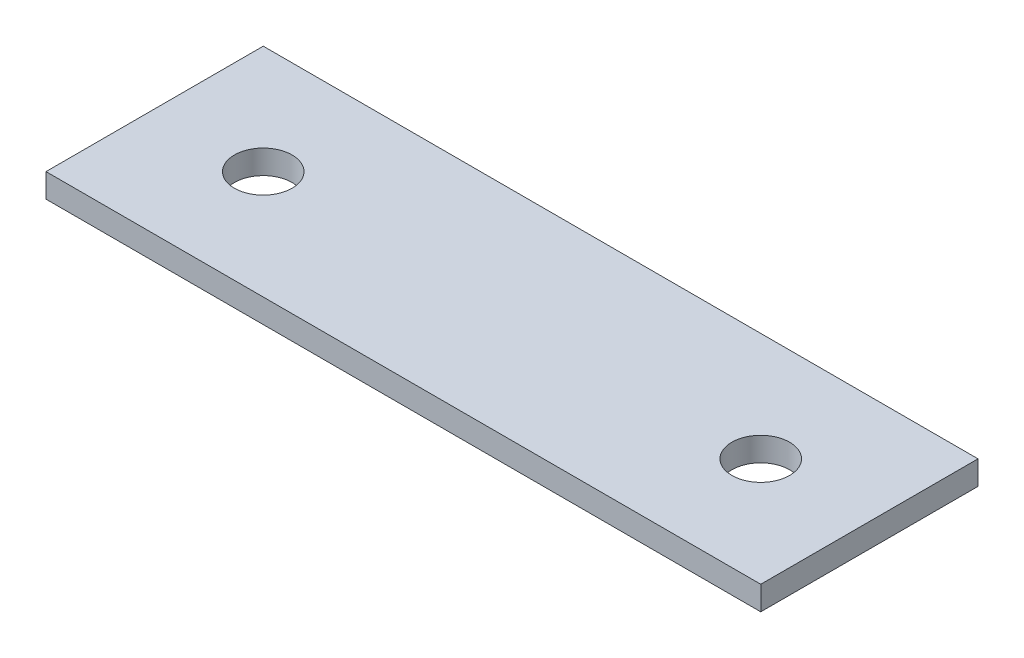
ISO-10303-21;
HEADER;
FILE_DESCRIPTION(('STEP AP214'),'2;1');
FILE_NAME('part.step','',(''),(''),'','','');
FILE_SCHEMA(('AUTOMOTIVE_DESIGN { 1 0 10303 214 1 1 1 1 }'));
ENDSEC;
DATA;
#1=APPLICATION_CONTEXT('core data for automotive mechanical design processes');
#2=APPLICATION_PROTOCOL_DEFINITION('international standard','automotive_design',2000,#1);
#3=PRODUCT_CONTEXT('',#1,'mechanical');
#4=PRODUCT('Part','Part','',(#3));
#5=PRODUCT_RELATED_PRODUCT_CATEGORY('part','',(#4));
#6=PRODUCT_DEFINITION_FORMATION('','',#4);
#7=PRODUCT_DEFINITION_CONTEXT('part definition',#1,'design');
#8=PRODUCT_DEFINITION('design','',#6,#7);
#9=PRODUCT_DEFINITION_SHAPE('','',#8);
#10=(LENGTH_UNIT() NAMED_UNIT(*) SI_UNIT(.MILLI.,.METRE.));
#11=(NAMED_UNIT(*) PLANE_ANGLE_UNIT() SI_UNIT($,.RADIAN.));
#12=(NAMED_UNIT(*) SI_UNIT($,.STERADIAN.) SOLID_ANGLE_UNIT());
#13=UNCERTAINTY_MEASURE_WITH_UNIT(LENGTH_MEASURE(1.E-05),#10,'distance_accuracy_value','');
#14=(GEOMETRIC_REPRESENTATION_CONTEXT(3) GLOBAL_UNCERTAINTY_ASSIGNED_CONTEXT((#13)) GLOBAL_UNIT_ASSIGNED_CONTEXT((#10,
#11,#12)) REPRESENTATION_CONTEXT('',''));
#15=CARTESIAN_POINT('',(0.,0.,0.));
#16=DIRECTION('',(0.,0.,1.));
#17=DIRECTION('',(1.,0.,0.));
#18=AXIS2_PLACEMENT_3D('',#15,#16,#17);
#19=CARTESIAN_POINT('',(0.,2.794,0.));
#20=DIRECTION('',(0.,1.,0.));
#21=DIRECTION('',(0.,0.,1.));
#22=AXIS2_PLACEMENT_3D('',#19,#20,#21);
#23=PLANE('',#22);
#24=CARTESIAN_POINT('',(-29.083,2.794,0.));
#25=DIRECTION('',(0.,1.,0.));
#26=DIRECTION('',(0.,0.,1.));
#27=AXIS2_PLACEMENT_3D('',#24,#25,#26);
#28=CIRCLE('',#27,3.3734375);
#29=CARTESIAN_POINT('',(-29.083,2.794,3.3734375));
#30=VERTEX_POINT('',#29);
#31=EDGE_CURVE('E100',#30,#30,#28,.T.);
#32=ORIENTED_EDGE('',*,*,#31,.F.);
#33=EDGE_LOOP('',(#32));
#34=FACE_BOUND('',#33,.T.);
#35=DIRECTION('',(0.,0.,-1.));
#36=VECTOR('',#35,1.);
#37=CARTESIAN_POINT('',(41.783,2.794,-12.7));
#38=LINE('',#37,#36);
#39=CARTESIAN_POINT('',(41.783,2.794,12.7));
#40=VERTEX_POINT('',#39);
#41=CARTESIAN_POINT('',(41.783,2.794,-12.7));
#42=VERTEX_POINT('',#41);
#43=EDGE_CURVE('E85',#40,#42,#38,.T.);
#44=ORIENTED_EDGE('',*,*,#43,.T.);
#45=DIRECTION('',(-1.,0.,0.));
#46=VECTOR('',#45,1.);
#47=CARTESIAN_POINT('',(-41.783,2.794,-12.7));
#48=LINE('',#47,#46);
#49=CARTESIAN_POINT('',(-41.783,2.794,-12.7));
#50=VERTEX_POINT('',#49);
#51=EDGE_CURVE('E80',#42,#50,#48,.T.);
#52=ORIENTED_EDGE('',*,*,#51,.T.);
#53=DIRECTION('',(0.,0.,1.));
#54=VECTOR('',#53,1.);
#55=CARTESIAN_POINT('',(-41.783,2.794,-12.7));
#56=LINE('',#55,#54);
#57=CARTESIAN_POINT('',(-41.783,2.794,12.7));
#58=VERTEX_POINT('',#57);
#59=EDGE_CURVE('E83',#50,#58,#56,.T.);
#60=ORIENTED_EDGE('',*,*,#59,.T.);
#61=DIRECTION('',(1.,0.,0.));
#62=VECTOR('',#61,1.);
#63=CARTESIAN_POINT('',(-41.783,2.794,12.7));
#64=LINE('',#63,#62);
#65=EDGE_CURVE('E50',#58,#40,#64,.T.);
#66=ORIENTED_EDGE('',*,*,#65,.T.);
#67=EDGE_LOOP('',(#44,#52,#60,#66));
#68=FACE_BOUND('',#67,.T.);
#69=CARTESIAN_POINT('',(29.083,2.794,0.));
#70=DIRECTION('',(0.,1.,0.));
#71=DIRECTION('',(0.,0.,1.));
#72=AXIS2_PLACEMENT_3D('',#69,#70,#71);
#73=CIRCLE('',#72,3.3734375);
#74=CARTESIAN_POINT('',(29.083,2.794,3.3734375));
#75=VERTEX_POINT('',#74);
#76=EDGE_CURVE('E115',#75,#75,#73,.T.);
#77=ORIENTED_EDGE('',*,*,#76,.F.);
#78=EDGE_LOOP('',(#77));
#79=FACE_BOUND('',#78,.T.);
#80=ADVANCED_FACE('F33',(#34,#68,#79),#23,.T.);
#81=CARTESIAN_POINT('',(0.,0.,0.));
#82=DIRECTION('',(0.,1.,0.));
#83=DIRECTION('',(0.,0.,1.));
#84=AXIS2_PLACEMENT_3D('',#81,#82,#83);
#85=PLANE('',#84);
#86=DIRECTION('',(0.,0.,-1.));
#87=VECTOR('',#86,1.);
#88=CARTESIAN_POINT('',(41.783,0.,-12.7));
#89=LINE('',#88,#87);
#90=CARTESIAN_POINT('',(41.783,0.,12.7));
#91=VERTEX_POINT('',#90);
#92=CARTESIAN_POINT('',(41.783,0.,-12.7));
#93=VERTEX_POINT('',#92);
#94=EDGE_CURVE('E97',#91,#93,#89,.T.);
#95=ORIENTED_EDGE('',*,*,#94,.F.);
#96=DIRECTION('',(1.,0.,0.));
#97=VECTOR('',#96,1.);
#98=CARTESIAN_POINT('',(-41.783,0.,12.7));
#99=LINE('',#98,#97);
#100=CARTESIAN_POINT('',(-41.783,0.,12.7));
#101=VERTEX_POINT('',#100);
#102=EDGE_CURVE('E73',#101,#91,#99,.T.);
#103=ORIENTED_EDGE('',*,*,#102,.F.);
#104=DIRECTION('',(0.,0.,1.));
#105=VECTOR('',#104,1.);
#106=CARTESIAN_POINT('',(-41.783,0.,-12.7));
#107=LINE('',#106,#105);
#108=CARTESIAN_POINT('',(-41.783,0.,-12.7));
#109=VERTEX_POINT('',#108);
#110=EDGE_CURVE('E67',#109,#101,#107,.T.);
#111=ORIENTED_EDGE('',*,*,#110,.F.);
#112=DIRECTION('',(-1.,0.,0.));
#113=VECTOR('',#112,1.);
#114=CARTESIAN_POINT('',(-41.783,0.,-12.7));
#115=LINE('',#114,#113);
#116=EDGE_CURVE('E89',#93,#109,#115,.T.);
#117=ORIENTED_EDGE('',*,*,#116,.F.);
#118=EDGE_LOOP('',(#95,#103,#111,#117));
#119=FACE_BOUND('',#118,.T.);
#120=CARTESIAN_POINT('',(-29.083,0.,0.));
#121=DIRECTION('',(0.,1.,0.));
#122=DIRECTION('',(0.,0.,1.));
#123=AXIS2_PLACEMENT_3D('',#120,#121,#122);
#124=CIRCLE('',#123,3.3734375);
#125=CARTESIAN_POINT('',(-29.083,0.,3.3734375));
#126=VERTEX_POINT('',#125);
#127=EDGE_CURVE('E112',#126,#126,#124,.T.);
#128=ORIENTED_EDGE('',*,*,#127,.T.);
#129=EDGE_LOOP('',(#128));
#130=FACE_BOUND('',#129,.T.);
#131=CARTESIAN_POINT('',(29.083,0.,0.));
#132=DIRECTION('',(0.,1.,0.));
#133=DIRECTION('',(0.,0.,1.));
#134=AXIS2_PLACEMENT_3D('',#131,#132,#133);
#135=CIRCLE('',#134,3.3734375);
#136=CARTESIAN_POINT('',(29.083,0.,3.3734375));
#137=VERTEX_POINT('',#136);
#138=EDGE_CURVE('E118',#137,#137,#135,.T.);
#139=ORIENTED_EDGE('',*,*,#138,.T.);
#140=EDGE_LOOP('',(#139));
#141=FACE_BOUND('',#140,.T.);
#142=ADVANCED_FACE('F108',(#119,#130,#141),#85,.F.);
#143=CARTESIAN_POINT('',(41.783,2.794,-12.7));
#144=DIRECTION('',(-1.,0.,0.));
#145=DIRECTION('',(0.,0.,1.));
#146=AXIS2_PLACEMENT_3D('',#143,#144,#145);
#147=PLANE('',#146);
#148=ORIENTED_EDGE('',*,*,#94,.T.);
#149=DIRECTION('',(0.,-1.,0.));
#150=VECTOR('',#149,1.);
#151=CARTESIAN_POINT('',(41.783,2.794,-12.7));
#152=LINE('',#151,#150);
#153=EDGE_CURVE('E11',#42,#93,#152,.T.);
#154=ORIENTED_EDGE('',*,*,#153,.F.);
#155=ORIENTED_EDGE('',*,*,#43,.F.);
#156=DIRECTION('',(0.,-1.,0.));
#157=VECTOR('',#156,1.);
#158=CARTESIAN_POINT('',(41.783,2.794,12.7));
#159=LINE('',#158,#157);
#160=EDGE_CURVE('E93',#40,#91,#159,.T.);
#161=ORIENTED_EDGE('',*,*,#160,.T.);
#162=EDGE_LOOP('',(#148,#154,#155,#161));
#163=FACE_BOUND('',#162,.T.);
#164=ADVANCED_FACE('F35',(#163),#147,.F.);
#165=CARTESIAN_POINT('',(-41.783,2.794,-12.7));
#166=DIRECTION('',(0.,0.,1.));
#167=DIRECTION('',(1.,0.,0.));
#168=AXIS2_PLACEMENT_3D('',#165,#166,#167);
#169=PLANE('',#168);
#170=ORIENTED_EDGE('',*,*,#116,.T.);
#171=DIRECTION('',(0.,-1.,0.));
#172=VECTOR('',#171,1.);
#173=CARTESIAN_POINT('',(-41.783,2.794,-12.7));
#174=LINE('',#173,#172);
#175=EDGE_CURVE('E42',#50,#109,#174,.T.);
#176=ORIENTED_EDGE('',*,*,#175,.F.);
#177=ORIENTED_EDGE('',*,*,#51,.F.);
#178=ORIENTED_EDGE('',*,*,#153,.T.);
#179=EDGE_LOOP('',(#170,#176,#177,#178));
#180=FACE_BOUND('',#179,.T.);
#181=ADVANCED_FACE('F88',(#180),#169,.F.);
#182=CARTESIAN_POINT('',(-41.783,2.794,-12.7));
#183=DIRECTION('',(1.,0.,0.));
#184=DIRECTION('',(0.,0.,-1.));
#185=AXIS2_PLACEMENT_3D('',#182,#183,#184);
#186=PLANE('',#185);
#187=ORIENTED_EDGE('',*,*,#110,.T.);
#188=DIRECTION('',(0.,-1.,0.));
#189=VECTOR('',#188,1.);
#190=CARTESIAN_POINT('',(-41.783,2.794,12.7));
#191=LINE('',#190,#189);
#192=EDGE_CURVE('E90',#58,#101,#191,.T.);
#193=ORIENTED_EDGE('',*,*,#192,.F.);
#194=ORIENTED_EDGE('',*,*,#59,.F.);
#195=ORIENTED_EDGE('',*,*,#175,.T.);
#196=EDGE_LOOP('',(#187,#193,#194,#195));
#197=FACE_BOUND('',#196,.T.);
#198=ADVANCED_FACE('F91',(#197),#186,.F.);
#199=CARTESIAN_POINT('',(-41.783,2.794,12.7));
#200=DIRECTION('',(0.,0.,-1.));
#201=DIRECTION('',(-1.,0.,0.));
#202=AXIS2_PLACEMENT_3D('',#199,#200,#201);
#203=PLANE('',#202);
#204=ORIENTED_EDGE('',*,*,#102,.T.);
#205=ORIENTED_EDGE('',*,*,#160,.F.);
#206=ORIENTED_EDGE('',*,*,#65,.F.);
#207=ORIENTED_EDGE('',*,*,#192,.T.);
#208=EDGE_LOOP('',(#204,#205,#206,#207));
#209=FACE_BOUND('',#208,.T.);
#210=ADVANCED_FACE('F105',(#209),#203,.F.);
#211=CARTESIAN_POINT('',(-29.083,2.794,0.));
#212=DIRECTION('',(0.,-1.,0.));
#213=DIRECTION('',(0.,0.,-1.));
#214=AXIS2_PLACEMENT_3D('',#211,#212,#213);
#215=CYLINDRICAL_SURFACE('',#214,3.3734375);
#216=ORIENTED_EDGE('',*,*,#31,.T.);
#217=EDGE_LOOP('',(#216));
#218=FACE_BOUND('',#217,.T.);
#219=ORIENTED_EDGE('',*,*,#127,.F.);
#220=EDGE_LOOP('',(#219));
#221=FACE_BOUND('',#220,.T.);
#222=ADVANCED_FACE('F135',(#218,#221),#215,.F.);
#223=CARTESIAN_POINT('',(29.083,2.794,0.));
#224=DIRECTION('',(0.,-1.,0.));
#225=DIRECTION('',(0.,0.,-1.));
#226=AXIS2_PLACEMENT_3D('',#223,#224,#225);
#227=CYLINDRICAL_SURFACE('',#226,3.3734375);
#228=ORIENTED_EDGE('',*,*,#76,.T.);
#229=EDGE_LOOP('',(#228));
#230=FACE_BOUND('',#229,.T.);
#231=ORIENTED_EDGE('',*,*,#138,.F.);
#232=EDGE_LOOP('',(#231));
#233=FACE_BOUND('',#232,.T.);
#234=ADVANCED_FACE('F124',(#230,#233),#227,.F.);
#235=CLOSED_SHELL('',(#80,#142,#164,#181,#198,#210,#222,#234));
#236=MANIFOLD_SOLID_BREP('B2',#235);
#237=ADVANCED_BREP_SHAPE_REPRESENTATION('',(#18,#236),#14);
#238=SHAPE_DEFINITION_REPRESENTATION(#9,#237);
ENDSEC;
END-ISO-10303-21;
